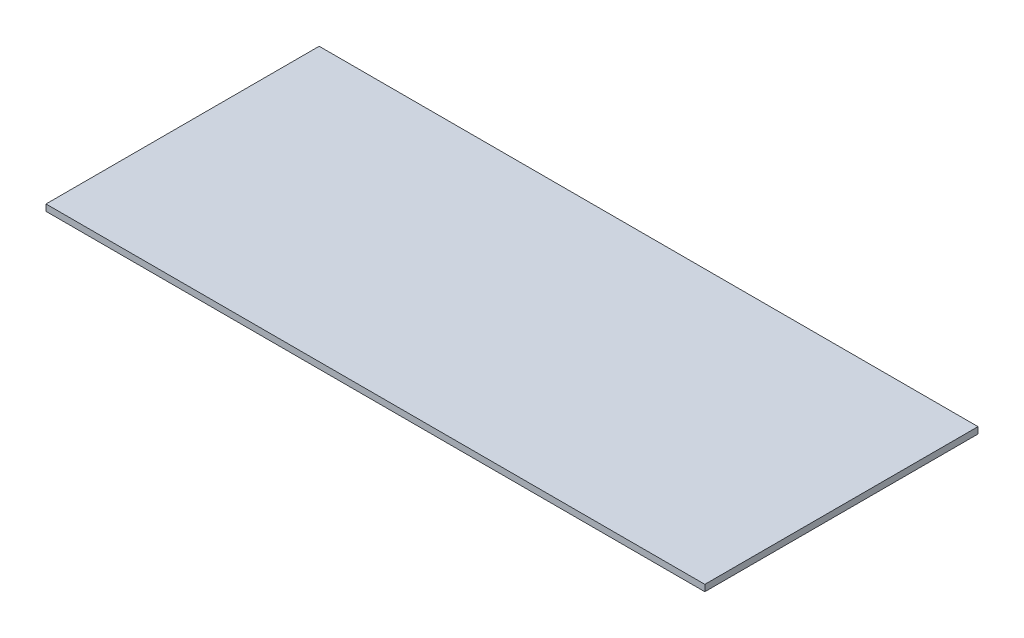
ISO-10303-21;
HEADER;
FILE_DESCRIPTION(('STEP AP214'),'2;1');
FILE_NAME('part.step','',(''),(''),'','','');
FILE_SCHEMA(('AUTOMOTIVE_DESIGN { 1 0 10303 214 1 1 1 1 }'));
ENDSEC;
DATA;
#1=APPLICATION_CONTEXT('core data for automotive mechanical design processes');
#2=APPLICATION_PROTOCOL_DEFINITION('international standard','automotive_design',2000,#1);
#3=PRODUCT_CONTEXT('',#1,'mechanical');
#4=PRODUCT('Part','Part','',(#3));
#5=PRODUCT_RELATED_PRODUCT_CATEGORY('part','',(#4));
#6=PRODUCT_DEFINITION_FORMATION('','',#4);
#7=PRODUCT_DEFINITION_CONTEXT('part definition',#1,'design');
#8=PRODUCT_DEFINITION('design','',#6,#7);
#9=PRODUCT_DEFINITION_SHAPE('','',#8);
#10=(LENGTH_UNIT() NAMED_UNIT(*) SI_UNIT(.MILLI.,.METRE.));
#11=(NAMED_UNIT(*) PLANE_ANGLE_UNIT() SI_UNIT($,.RADIAN.));
#12=(NAMED_UNIT(*) SI_UNIT($,.STERADIAN.) SOLID_ANGLE_UNIT());
#13=UNCERTAINTY_MEASURE_WITH_UNIT(LENGTH_MEASURE(1.E-05),#10,'distance_accuracy_value','');
#14=(GEOMETRIC_REPRESENTATION_CONTEXT(3) GLOBAL_UNCERTAINTY_ASSIGNED_CONTEXT((#13)) GLOBAL_UNIT_ASSIGNED_CONTEXT((#10,
#11,#12)) REPRESENTATION_CONTEXT('',''));
#15=CARTESIAN_POINT('',(0.,0.,0.));
#16=DIRECTION('',(0.,0.,1.));
#17=DIRECTION('',(1.,0.,0.));
#18=AXIS2_PLACEMENT_3D('',#15,#16,#17);
#19=CARTESIAN_POINT('',(205.,4.,-85.));
#20=DIRECTION('',(-1.,0.,0.));
#21=DIRECTION('',(0.,0.,1.));
#22=AXIS2_PLACEMENT_3D('',#19,#20,#21);
#23=PLANE('',#22);
#24=DIRECTION('',(0.,0.,-1.));
#25=VECTOR('',#24,1.);
#26=CARTESIAN_POINT('',(205.,0.,-85.));
#27=LINE('',#26,#25);
#28=CARTESIAN_POINT('',(205.,0.,85.));
#29=VERTEX_POINT('',#28);
#30=CARTESIAN_POINT('',(205.,0.,-85.));
#31=VERTEX_POINT('',#30);
#32=EDGE_CURVE('E108',#29,#31,#27,.T.);
#33=ORIENTED_EDGE('',*,*,#32,.T.);
#34=DIRECTION('',(0.,-1.,0.));
#35=VECTOR('',#34,1.);
#36=CARTESIAN_POINT('',(205.,4.,-85.));
#37=LINE('',#36,#35);
#38=CARTESIAN_POINT('',(205.,4.,-85.));
#39=VERTEX_POINT('',#38);
#40=EDGE_CURVE('E11',#39,#31,#37,.T.);
#41=ORIENTED_EDGE('',*,*,#40,.F.);
#42=DIRECTION('',(0.,0.,-1.));
#43=VECTOR('',#42,1.);
#44=CARTESIAN_POINT('',(205.,4.,-85.));
#45=LINE('',#44,#43);
#46=CARTESIAN_POINT('',(205.,4.,85.));
#47=VERTEX_POINT('',#46);
#48=EDGE_CURVE('E96',#47,#39,#45,.T.);
#49=ORIENTED_EDGE('',*,*,#48,.F.);
#50=DIRECTION('',(0.,-1.,0.));
#51=VECTOR('',#50,1.);
#52=CARTESIAN_POINT('',(205.,4.,85.));
#53=LINE('',#52,#51);
#54=EDGE_CURVE('E104',#47,#29,#53,.T.);
#55=ORIENTED_EDGE('',*,*,#54,.T.);
#56=EDGE_LOOP('',(#33,#41,#49,#55));
#57=FACE_BOUND('',#56,.T.);
#58=ADVANCED_FACE('F45',(#57),#23,.F.);
#59=CARTESIAN_POINT('',(-205.,4.,-85.));
#60=DIRECTION('',(0.,0.,1.));
#61=DIRECTION('',(1.,0.,0.));
#62=AXIS2_PLACEMENT_3D('',#59,#60,#61);
#63=PLANE('',#62);
#64=DIRECTION('',(-1.,0.,0.));
#65=VECTOR('',#64,1.);
#66=CARTESIAN_POINT('',(-205.,0.,-85.));
#67=LINE('',#66,#65);
#68=CARTESIAN_POINT('',(-205.,0.,-85.));
#69=VERTEX_POINT('',#68);
#70=EDGE_CURVE('E100',#31,#69,#67,.T.);
#71=ORIENTED_EDGE('',*,*,#70,.T.);
#72=DIRECTION('',(0.,-1.,0.));
#73=VECTOR('',#72,1.);
#74=CARTESIAN_POINT('',(-205.,4.,-85.));
#75=LINE('',#74,#73);
#76=CARTESIAN_POINT('',(-205.,4.,-85.));
#77=VERTEX_POINT('',#76);
#78=EDGE_CURVE('E53',#77,#69,#75,.T.);
#79=ORIENTED_EDGE('',*,*,#78,.F.);
#80=DIRECTION('',(-1.,0.,0.));
#81=VECTOR('',#80,1.);
#82=CARTESIAN_POINT('',(-205.,4.,-85.));
#83=LINE('',#82,#81);
#84=EDGE_CURVE('E91',#39,#77,#83,.T.);
#85=ORIENTED_EDGE('',*,*,#84,.F.);
#86=ORIENTED_EDGE('',*,*,#40,.T.);
#87=EDGE_LOOP('',(#71,#79,#85,#86));
#88=FACE_BOUND('',#87,.T.);
#89=ADVANCED_FACE('F99',(#88),#63,.F.);
#90=CARTESIAN_POINT('',(-205.,4.,-85.));
#91=DIRECTION('',(1.,0.,0.));
#92=DIRECTION('',(0.,0.,-1.));
#93=AXIS2_PLACEMENT_3D('',#90,#91,#92);
#94=PLANE('',#93);
#95=DIRECTION('',(0.,0.,1.));
#96=VECTOR('',#95,1.);
#97=CARTESIAN_POINT('',(-205.,0.,-85.));
#98=LINE('',#97,#96);
#99=CARTESIAN_POINT('',(-205.,0.,85.));
#100=VERTEX_POINT('',#99);
#101=EDGE_CURVE('E78',#69,#100,#98,.T.);
#102=ORIENTED_EDGE('',*,*,#101,.T.);
#103=DIRECTION('',(0.,-1.,0.));
#104=VECTOR('',#103,1.);
#105=CARTESIAN_POINT('',(-205.,4.,85.));
#106=LINE('',#105,#104);
#107=CARTESIAN_POINT('',(-205.,4.,85.));
#108=VERTEX_POINT('',#107);
#109=EDGE_CURVE('E101',#108,#100,#106,.T.);
#110=ORIENTED_EDGE('',*,*,#109,.F.);
#111=DIRECTION('',(0.,0.,1.));
#112=VECTOR('',#111,1.);
#113=CARTESIAN_POINT('',(-205.,4.,-85.));
#114=LINE('',#113,#112);
#115=EDGE_CURVE('E94',#77,#108,#114,.T.);
#116=ORIENTED_EDGE('',*,*,#115,.F.);
#117=ORIENTED_EDGE('',*,*,#78,.T.);
#118=EDGE_LOOP('',(#102,#110,#116,#117));
#119=FACE_BOUND('',#118,.T.);
#120=ADVANCED_FACE('F102',(#119),#94,.F.);
#121=CARTESIAN_POINT('',(-205.,4.,85.));
#122=DIRECTION('',(0.,0.,-1.));
#123=DIRECTION('',(-1.,0.,0.));
#124=AXIS2_PLACEMENT_3D('',#121,#122,#123);
#125=PLANE('',#124);
#126=DIRECTION('',(1.,0.,0.));
#127=VECTOR('',#126,1.);
#128=CARTESIAN_POINT('',(-205.,0.,85.));
#129=LINE('',#128,#127);
#130=EDGE_CURVE('E84',#100,#29,#129,.T.);
#131=ORIENTED_EDGE('',*,*,#130,.T.);
#132=ORIENTED_EDGE('',*,*,#54,.F.);
#133=DIRECTION('',(1.,0.,0.));
#134=VECTOR('',#133,1.);
#135=CARTESIAN_POINT('',(-205.,4.,85.));
#136=LINE('',#135,#134);
#137=EDGE_CURVE('E61',#108,#47,#136,.T.);
#138=ORIENTED_EDGE('',*,*,#137,.F.);
#139=ORIENTED_EDGE('',*,*,#109,.T.);
#140=EDGE_LOOP('',(#131,#132,#138,#139));
#141=FACE_BOUND('',#140,.T.);
#142=ADVANCED_FACE('F115',(#141),#125,.F.);
#143=CARTESIAN_POINT('',(0.,4.,0.));
#144=DIRECTION('',(0.,1.,0.));
#145=DIRECTION('',(0.,0.,1.));
#146=AXIS2_PLACEMENT_3D('',#143,#144,#145);
#147=PLANE('',#146);
#148=ORIENTED_EDGE('',*,*,#48,.T.);
#149=ORIENTED_EDGE('',*,*,#84,.T.);
#150=ORIENTED_EDGE('',*,*,#115,.T.);
#151=ORIENTED_EDGE('',*,*,#137,.T.);
#152=EDGE_LOOP('',(#148,#149,#150,#151));
#153=FACE_BOUND('',#152,.T.);
#154=ADVANCED_FACE('F92',(#153),#147,.T.);
#155=CARTESIAN_POINT('',(0.,0.,0.));
#156=DIRECTION('',(0.,1.,0.));
#157=DIRECTION('',(0.,0.,1.));
#158=AXIS2_PLACEMENT_3D('',#155,#156,#157);
#159=PLANE('',#158);
#160=ORIENTED_EDGE('',*,*,#32,.F.);
#161=ORIENTED_EDGE('',*,*,#130,.F.);
#162=ORIENTED_EDGE('',*,*,#101,.F.);
#163=ORIENTED_EDGE('',*,*,#70,.F.);
#164=EDGE_LOOP('',(#160,#161,#162,#163));
#165=FACE_BOUND('',#164,.T.);
#166=ADVANCED_FACE('F118',(#165),#159,.F.);
#167=CLOSED_SHELL('',(#58,#89,#120,#142,#154,#166));
#168=MANIFOLD_SOLID_BREP('B2',#167);
#169=ADVANCED_BREP_SHAPE_REPRESENTATION('',(#18,#168),#14);
#170=SHAPE_DEFINITION_REPRESENTATION(#9,#169);
ENDSEC;
END-ISO-10303-21;
